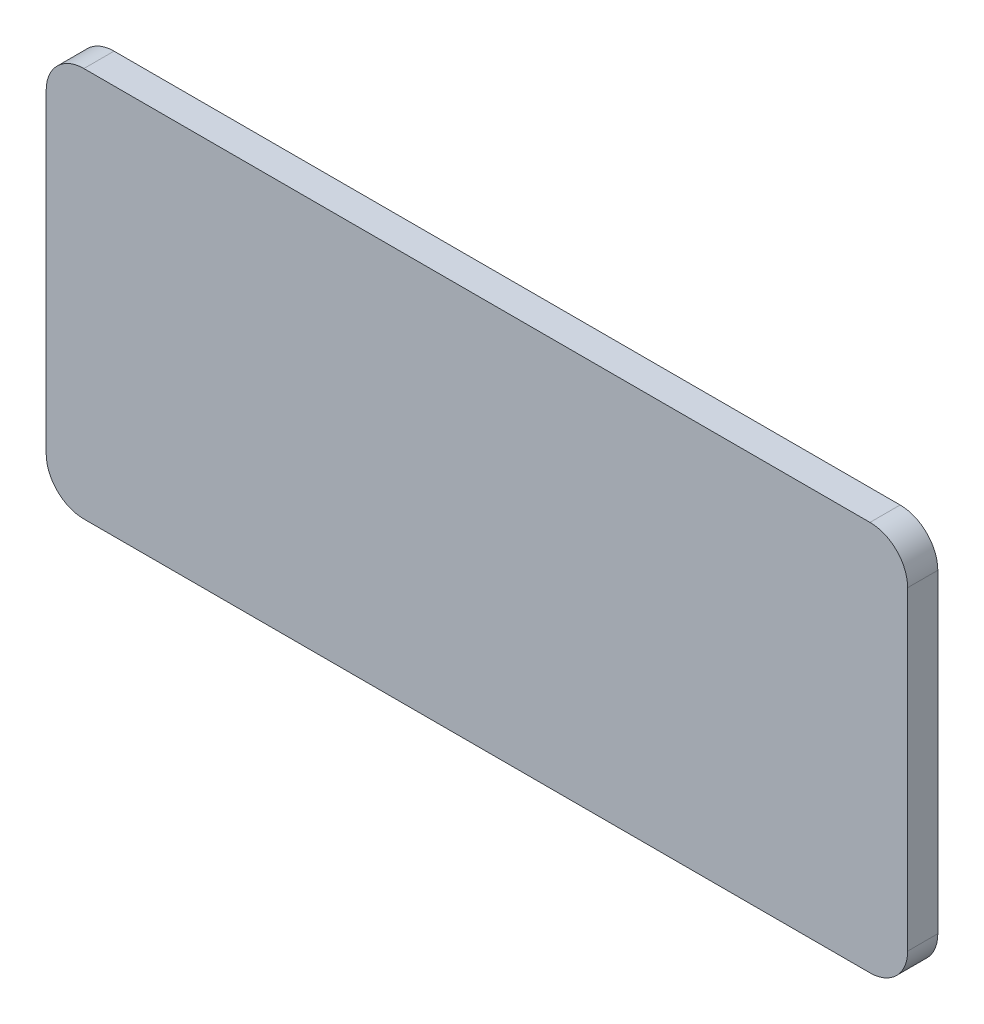
ISO-10303-21;
HEADER;
FILE_DESCRIPTION(('STEP AP214'),'2;1');
FILE_NAME('part.step','',(''),(''),'','','');
FILE_SCHEMA(('AUTOMOTIVE_DESIGN { 1 0 10303 214 1 1 1 1 }'));
ENDSEC;
DATA;
#1=APPLICATION_CONTEXT('core data for automotive mechanical design processes');
#2=APPLICATION_PROTOCOL_DEFINITION('international standard','automotive_design',2000,#1);
#3=PRODUCT_CONTEXT('',#1,'mechanical');
#4=PRODUCT('Part','Part','',(#3));
#5=PRODUCT_RELATED_PRODUCT_CATEGORY('part','',(#4));
#6=PRODUCT_DEFINITION_FORMATION('','',#4);
#7=PRODUCT_DEFINITION_CONTEXT('part definition',#1,'design');
#8=PRODUCT_DEFINITION('design','',#6,#7);
#9=PRODUCT_DEFINITION_SHAPE('','',#8);
#10=(LENGTH_UNIT() NAMED_UNIT(*) SI_UNIT(.MILLI.,.METRE.));
#11=(NAMED_UNIT(*) PLANE_ANGLE_UNIT() SI_UNIT($,.RADIAN.));
#12=(NAMED_UNIT(*) SI_UNIT($,.STERADIAN.) SOLID_ANGLE_UNIT());
#13=UNCERTAINTY_MEASURE_WITH_UNIT(LENGTH_MEASURE(1.E-05),#10,'distance_accuracy_value','');
#14=(GEOMETRIC_REPRESENTATION_CONTEXT(3) GLOBAL_UNCERTAINTY_ASSIGNED_CONTEXT((#13)) GLOBAL_UNIT_ASSIGNED_CONTEXT((#10,
#11,#12)) REPRESENTATION_CONTEXT('',''));
#15=CARTESIAN_POINT('',(0.,0.,0.));
#16=DIRECTION('',(0.,0.,1.));
#17=DIRECTION('',(1.,0.,0.));
#18=AXIS2_PLACEMENT_3D('',#15,#16,#17);
#19=CARTESIAN_POINT('',(-22.855,10.35,1.6));
#20=DIRECTION('',(1.,0.,0.));
#21=DIRECTION('',(0.,0.,-1.));
#22=AXIS2_PLACEMENT_3D('',#19,#20,#21);
#23=PLANE('',#22);
#24=DIRECTION('',(0.,-1.,0.));
#25=VECTOR('',#24,1.);
#26=CARTESIAN_POINT('',(-22.855,10.35,0.));
#27=LINE('',#26,#25);
#28=CARTESIAN_POINT('',(-22.855,8.35,0.));
#29=VERTEX_POINT('',#28);
#30=CARTESIAN_POINT('',(-22.855,-8.35,0.));
#31=VERTEX_POINT('',#30);
#32=EDGE_CURVE('E128',#29,#31,#27,.T.);
#33=ORIENTED_EDGE('',*,*,#32,.T.);
#34=DIRECTION('',(0.,0.,-1.));
#35=VECTOR('',#34,1.);
#36=CARTESIAN_POINT('',(-22.855,-8.35,1.6));
#37=LINE('',#36,#35);
#38=CARTESIAN_POINT('',(-22.855,-8.35,1.6));
#39=VERTEX_POINT('',#38);
#40=EDGE_CURVE('E106',#31,#39,#37,.F.);
#41=ORIENTED_EDGE('',*,*,#40,.T.);
#42=DIRECTION('',(0.,-1.,0.));
#43=VECTOR('',#42,1.);
#44=CARTESIAN_POINT('',(-22.855,10.35,1.6));
#45=LINE('',#44,#43);
#46=CARTESIAN_POINT('',(-22.855,8.35,1.6));
#47=VERTEX_POINT('',#46);
#48=EDGE_CURVE('E137',#47,#39,#45,.T.);
#49=ORIENTED_EDGE('',*,*,#48,.F.);
#50=DIRECTION('',(0.,0.,-1.));
#51=VECTOR('',#50,1.);
#52=CARTESIAN_POINT('',(-22.855,8.35,1.6));
#53=LINE('',#52,#51);
#54=EDGE_CURVE('E111',#47,#29,#53,.T.);
#55=ORIENTED_EDGE('',*,*,#54,.T.);
#56=EDGE_LOOP('',(#33,#41,#49,#55));
#57=FACE_BOUND('',#56,.T.);
#58=ADVANCED_FACE('F35',(#57),#23,.F.);
#59=CARTESIAN_POINT('',(-22.855,-10.35,1.6));
#60=DIRECTION('',(0.,1.,0.));
#61=DIRECTION('',(-1.,0.,0.));
#62=AXIS2_PLACEMENT_3D('',#59,#60,#61);
#63=PLANE('',#62);
#64=DIRECTION('',(1.,0.,0.));
#65=VECTOR('',#64,1.);
#66=CARTESIAN_POINT('',(-22.855,-10.35,1.6));
#67=LINE('',#66,#65);
#68=CARTESIAN_POINT('',(-20.855,-10.35,1.6));
#69=VERTEX_POINT('',#68);
#70=CARTESIAN_POINT('',(20.855,-10.35,1.6));
#71=VERTEX_POINT('',#70);
#72=EDGE_CURVE('E121',#69,#71,#67,.T.);
#73=ORIENTED_EDGE('',*,*,#72,.F.);
#74=DIRECTION('',(0.,0.,-1.));
#75=VECTOR('',#74,1.);
#76=CARTESIAN_POINT('',(-20.855,-10.35,1.6));
#77=LINE('',#76,#75);
#78=CARTESIAN_POINT('',(-20.855,-10.35,0.));
#79=VERTEX_POINT('',#78);
#80=EDGE_CURVE('E105',#69,#79,#77,.T.);
#81=ORIENTED_EDGE('',*,*,#80,.T.);
#82=DIRECTION('',(1.,0.,0.));
#83=VECTOR('',#82,1.);
#84=CARTESIAN_POINT('',(-22.855,-10.35,0.));
#85=LINE('',#84,#83);
#86=CARTESIAN_POINT('',(20.855,-10.35,0.));
#87=VERTEX_POINT('',#86);
#88=EDGE_CURVE('E118',#79,#87,#85,.T.);
#89=ORIENTED_EDGE('',*,*,#88,.T.);
#90=DIRECTION('',(0.,0.,-1.));
#91=VECTOR('',#90,1.);
#92=CARTESIAN_POINT('',(20.855,-10.35,1.6));
#93=LINE('',#92,#91);
#94=EDGE_CURVE('E123',#87,#71,#93,.F.);
#95=ORIENTED_EDGE('',*,*,#94,.T.);
#96=EDGE_LOOP('',(#73,#81,#89,#95));
#97=FACE_BOUND('',#96,.T.);
#98=ADVANCED_FACE('F117',(#97),#63,.F.);
#99=CARTESIAN_POINT('',(22.855,10.35,1.6));
#100=DIRECTION('',(-1.,0.,0.));
#101=DIRECTION('',(0.,-1.,0.));
#102=AXIS2_PLACEMENT_3D('',#99,#100,#101);
#103=PLANE('',#102);
#104=DIRECTION('',(0.,1.,0.));
#105=VECTOR('',#104,1.);
#106=CARTESIAN_POINT('',(22.855,10.35,1.6));
#107=LINE('',#106,#105);
#108=CARTESIAN_POINT('',(22.855,-8.35,1.6));
#109=VERTEX_POINT('',#108);
#110=CARTESIAN_POINT('',(22.855,8.35,1.6));
#111=VERTEX_POINT('',#110);
#112=EDGE_CURVE('E163',#109,#111,#107,.T.);
#113=ORIENTED_EDGE('',*,*,#112,.F.);
#114=DIRECTION('',(0.,0.,-1.));
#115=VECTOR('',#114,1.);
#116=CARTESIAN_POINT('',(22.855,-8.35,1.6));
#117=LINE('',#116,#115);
#118=CARTESIAN_POINT('',(22.855,-8.35,0.));
#119=VERTEX_POINT('',#118);
#120=EDGE_CURVE('E156',#109,#119,#117,.T.);
#121=ORIENTED_EDGE('',*,*,#120,.T.);
#122=DIRECTION('',(0.,1.,0.));
#123=VECTOR('',#122,1.);
#124=CARTESIAN_POINT('',(22.855,10.35,0.));
#125=LINE('',#124,#123);
#126=CARTESIAN_POINT('',(22.855,8.35,0.));
#127=VERTEX_POINT('',#126);
#128=EDGE_CURVE('E127',#119,#127,#125,.T.);
#129=ORIENTED_EDGE('',*,*,#128,.T.);
#130=DIRECTION('',(0.,0.,-1.));
#131=VECTOR('',#130,1.);
#132=CARTESIAN_POINT('',(22.855,8.35,1.6));
#133=LINE('',#132,#131);
#134=EDGE_CURVE('E154',#127,#111,#133,.F.);
#135=ORIENTED_EDGE('',*,*,#134,.T.);
#136=EDGE_LOOP('',(#113,#121,#129,#135));
#137=FACE_BOUND('',#136,.T.);
#138=ADVANCED_FACE('F161',(#137),#103,.F.);
#139=CARTESIAN_POINT('',(-22.855,10.35,1.6));
#140=DIRECTION('',(0.,-1.,0.));
#141=DIRECTION('',(0.,0.,-1.));
#142=AXIS2_PLACEMENT_3D('',#139,#140,#141);
#143=PLANE('',#142);
#144=DIRECTION('',(-1.,0.,0.));
#145=VECTOR('',#144,1.);
#146=CARTESIAN_POINT('',(-22.855,10.35,1.6));
#147=LINE('',#146,#145);
#148=CARTESIAN_POINT('',(20.855,10.35,1.6));
#149=VERTEX_POINT('',#148);
#150=CARTESIAN_POINT('',(-20.855,10.35,1.6));
#151=VERTEX_POINT('',#150);
#152=EDGE_CURVE('E138',#149,#151,#147,.T.);
#153=ORIENTED_EDGE('',*,*,#152,.F.);
#154=DIRECTION('',(0.,0.,-1.));
#155=VECTOR('',#154,1.);
#156=CARTESIAN_POINT('',(20.855,10.35,1.6));
#157=LINE('',#156,#155);
#158=CARTESIAN_POINT('',(20.855,10.35,0.));
#159=VERTEX_POINT('',#158);
#160=EDGE_CURVE('E11',#149,#159,#157,.T.);
#161=ORIENTED_EDGE('',*,*,#160,.T.);
#162=DIRECTION('',(-1.,0.,0.));
#163=VECTOR('',#162,1.);
#164=CARTESIAN_POINT('',(-22.855,10.35,0.));
#165=LINE('',#164,#163);
#166=CARTESIAN_POINT('',(-20.855,10.35,0.));
#167=VERTEX_POINT('',#166);
#168=EDGE_CURVE('E131',#159,#167,#165,.T.);
#169=ORIENTED_EDGE('',*,*,#168,.T.);
#170=DIRECTION('',(0.,0.,-1.));
#171=VECTOR('',#170,1.);
#172=CARTESIAN_POINT('',(-20.855,10.35,1.6));
#173=LINE('',#172,#171);
#174=EDGE_CURVE('E43',#167,#151,#173,.F.);
#175=ORIENTED_EDGE('',*,*,#174,.T.);
#176=EDGE_LOOP('',(#153,#161,#169,#175));
#177=FACE_BOUND('',#176,.T.);
#178=ADVANCED_FACE('F170',(#177),#143,.F.);
#179=CARTESIAN_POINT('',(0.,0.,1.6));
#180=DIRECTION('',(0.,0.,1.));
#181=DIRECTION('',(1.,0.,0.));
#182=AXIS2_PLACEMENT_3D('',#179,#180,#181);
#183=PLANE('',#182);
#184=ORIENTED_EDGE('',*,*,#48,.T.);
#185=CARTESIAN_POINT('',(-20.855,-8.35,1.6));
#186=DIRECTION('',(0.,0.,1.));
#187=DIRECTION('',(1.,0.,0.));
#188=AXIS2_PLACEMENT_3D('',#185,#186,#187);
#189=CIRCLE('',#188,2.);
#190=EDGE_CURVE('E152',#39,#69,#189,.T.);
#191=ORIENTED_EDGE('',*,*,#190,.T.);
#192=ORIENTED_EDGE('',*,*,#72,.T.);
#193=CARTESIAN_POINT('',(20.855,-8.35,1.6));
#194=DIRECTION('',(0.,0.,1.));
#195=DIRECTION('',(1.,0.,0.));
#196=AXIS2_PLACEMENT_3D('',#193,#194,#195);
#197=CIRCLE('',#196,2.);
#198=EDGE_CURVE('E150',#71,#109,#197,.T.);
#199=ORIENTED_EDGE('',*,*,#198,.T.);
#200=ORIENTED_EDGE('',*,*,#112,.T.);
#201=CARTESIAN_POINT('',(20.855,8.35,1.6));
#202=DIRECTION('',(0.,0.,1.));
#203=DIRECTION('',(1.,0.,0.));
#204=AXIS2_PLACEMENT_3D('',#201,#202,#203);
#205=CIRCLE('',#204,2.);
#206=EDGE_CURVE('E56',#111,#149,#205,.T.);
#207=ORIENTED_EDGE('',*,*,#206,.T.);
#208=ORIENTED_EDGE('',*,*,#152,.T.);
#209=CARTESIAN_POINT('',(-20.855,8.35,1.6));
#210=DIRECTION('',(0.,0.,1.));
#211=DIRECTION('',(1.,0.,0.));
#212=AXIS2_PLACEMENT_3D('',#209,#210,#211);
#213=CIRCLE('',#212,2.);
#214=EDGE_CURVE('E147',#151,#47,#213,.T.);
#215=ORIENTED_EDGE('',*,*,#214,.T.);
#216=EDGE_LOOP('',(#184,#191,#192,#199,#200,#207,#208,#215));
#217=FACE_BOUND('',#216,.T.);
#218=ADVANCED_FACE('F177',(#217),#183,.T.);
#219=CARTESIAN_POINT('',(0.,0.,0.));
#220=DIRECTION('',(0.,0.,1.));
#221=DIRECTION('',(1.,0.,0.));
#222=AXIS2_PLACEMENT_3D('',#219,#220,#221);
#223=PLANE('',#222);
#224=ORIENTED_EDGE('',*,*,#88,.F.);
#225=CARTESIAN_POINT('',(-20.855,-8.35,0.));
#226=DIRECTION('',(0.,0.,1.));
#227=DIRECTION('',(1.,0.,0.));
#228=AXIS2_PLACEMENT_3D('',#225,#226,#227);
#229=CIRCLE('',#228,2.);
#230=EDGE_CURVE('E101',#79,#31,#229,.F.);
#231=ORIENTED_EDGE('',*,*,#230,.T.);
#232=ORIENTED_EDGE('',*,*,#32,.F.);
#233=CARTESIAN_POINT('',(-20.855,8.35,0.));
#234=DIRECTION('',(0.,0.,1.));
#235=DIRECTION('',(1.,0.,0.));
#236=AXIS2_PLACEMENT_3D('',#233,#234,#235);
#237=CIRCLE('',#236,2.);
#238=EDGE_CURVE('E122',#29,#167,#237,.F.);
#239=ORIENTED_EDGE('',*,*,#238,.T.);
#240=ORIENTED_EDGE('',*,*,#168,.F.);
#241=CARTESIAN_POINT('',(20.855,8.35,0.));
#242=DIRECTION('',(0.,0.,1.));
#243=DIRECTION('',(1.,0.,0.));
#244=AXIS2_PLACEMENT_3D('',#241,#242,#243);
#245=CIRCLE('',#244,2.);
#246=EDGE_CURVE('E141',#159,#127,#245,.F.);
#247=ORIENTED_EDGE('',*,*,#246,.T.);
#248=ORIENTED_EDGE('',*,*,#128,.F.);
#249=CARTESIAN_POINT('',(20.855,-8.35,0.));
#250=DIRECTION('',(0.,0.,1.));
#251=DIRECTION('',(1.,0.,0.));
#252=AXIS2_PLACEMENT_3D('',#249,#250,#251);
#253=CIRCLE('',#252,2.);
#254=EDGE_CURVE('E112',#119,#87,#253,.F.);
#255=ORIENTED_EDGE('',*,*,#254,.T.);
#256=EDGE_LOOP('',(#224,#231,#232,#239,#240,#247,#248,#255));
#257=FACE_BOUND('',#256,.T.);
#258=ADVANCED_FACE('F125',(#257),#223,.F.);
#259=CARTESIAN_POINT('',(-20.855,-8.35,1.6));
#260=DIRECTION('',(0.,0.,-1.));
#261=DIRECTION('',(-1.,0.,0.));
#262=AXIS2_PLACEMENT_3D('',#259,#260,#261);
#263=CYLINDRICAL_SURFACE('',#262,2.);
#264=ORIENTED_EDGE('',*,*,#190,.F.);
#265=ORIENTED_EDGE('',*,*,#40,.F.);
#266=ORIENTED_EDGE('',*,*,#230,.F.);
#267=ORIENTED_EDGE('',*,*,#80,.F.);
#268=EDGE_LOOP('',(#264,#265,#266,#267));
#269=FACE_BOUND('',#268,.T.);
#270=ADVANCED_FACE('F104',(#269),#263,.T.);
#271=CARTESIAN_POINT('',(20.855,-8.35,1.6));
#272=DIRECTION('',(0.,0.,-1.));
#273=DIRECTION('',(-1.,0.,0.));
#274=AXIS2_PLACEMENT_3D('',#271,#272,#273);
#275=CYLINDRICAL_SURFACE('',#274,2.);
#276=ORIENTED_EDGE('',*,*,#198,.F.);
#277=ORIENTED_EDGE('',*,*,#94,.F.);
#278=ORIENTED_EDGE('',*,*,#254,.F.);
#279=ORIENTED_EDGE('',*,*,#120,.F.);
#280=EDGE_LOOP('',(#276,#277,#278,#279));
#281=FACE_BOUND('',#280,.T.);
#282=ADVANCED_FACE('F185',(#281),#275,.T.);
#283=CARTESIAN_POINT('',(20.855,8.35,1.6));
#284=DIRECTION('',(0.,0.,-1.));
#285=DIRECTION('',(-1.,0.,0.));
#286=AXIS2_PLACEMENT_3D('',#283,#284,#285);
#287=CYLINDRICAL_SURFACE('',#286,2.);
#288=ORIENTED_EDGE('',*,*,#206,.F.);
#289=ORIENTED_EDGE('',*,*,#134,.F.);
#290=ORIENTED_EDGE('',*,*,#246,.F.);
#291=ORIENTED_EDGE('',*,*,#160,.F.);
#292=EDGE_LOOP('',(#288,#289,#290,#291));
#293=FACE_BOUND('',#292,.T.);
#294=ADVANCED_FACE('F169',(#293),#287,.T.);
#295=CARTESIAN_POINT('',(-20.855,8.35,1.6));
#296=DIRECTION('',(0.,0.,-1.));
#297=DIRECTION('',(-1.,0.,0.));
#298=AXIS2_PLACEMENT_3D('',#295,#296,#297);
#299=CYLINDRICAL_SURFACE('',#298,2.);
#300=ORIENTED_EDGE('',*,*,#214,.F.);
#301=ORIENTED_EDGE('',*,*,#174,.F.);
#302=ORIENTED_EDGE('',*,*,#238,.F.);
#303=ORIENTED_EDGE('',*,*,#54,.F.);
#304=EDGE_LOOP('',(#300,#301,#302,#303));
#305=FACE_BOUND('',#304,.T.);
#306=ADVANCED_FACE('F37',(#305),#299,.T.);
#307=CLOSED_SHELL('',(#58,#98,#138,#178,#218,#258,#270,#282,#294,#306));
#308=MANIFOLD_SOLID_BREP('B2',#307);
#309=ADVANCED_BREP_SHAPE_REPRESENTATION('',(#18,#308),#14);
#310=SHAPE_DEFINITION_REPRESENTATION(#9,#309);
ENDSEC;
END-ISO-10303-21;
